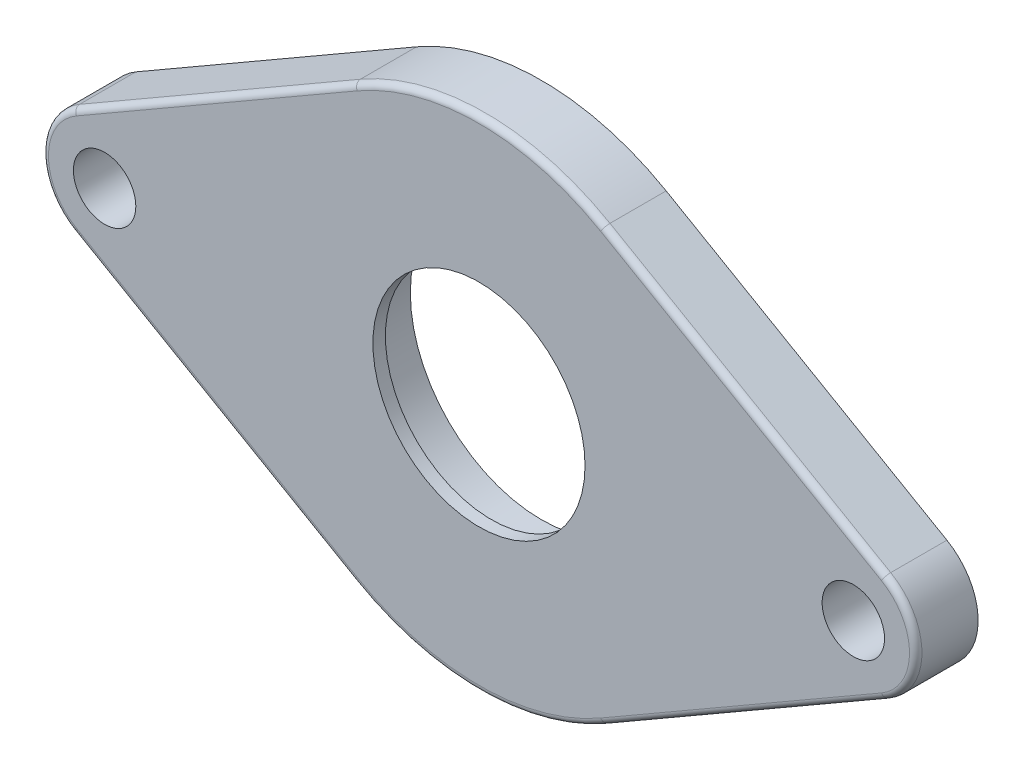
ISO-10303-21;
HEADER;
FILE_DESCRIPTION(('STEP AP214'),'2;1');
FILE_NAME('part.step','',(''),(''),'','','');
FILE_SCHEMA(('AUTOMOTIVE_DESIGN { 1 0 10303 214 1 1 1 1 }'));
ENDSEC;
DATA;
#1=APPLICATION_CONTEXT('core data for automotive mechanical design processes');
#2=APPLICATION_PROTOCOL_DEFINITION('international standard','automotive_design',2000,#1);
#3=PRODUCT_CONTEXT('',#1,'mechanical');
#4=PRODUCT('Part','Part','',(#3));
#5=PRODUCT_RELATED_PRODUCT_CATEGORY('part','',(#4));
#6=PRODUCT_DEFINITION_FORMATION('','',#4);
#7=PRODUCT_DEFINITION_CONTEXT('part definition',#1,'design');
#8=PRODUCT_DEFINITION('design','',#6,#7);
#9=PRODUCT_DEFINITION_SHAPE('','',#8);
#10=(LENGTH_UNIT() NAMED_UNIT(*) SI_UNIT(.MILLI.,.METRE.));
#11=(NAMED_UNIT(*) PLANE_ANGLE_UNIT() SI_UNIT($,.RADIAN.));
#12=(NAMED_UNIT(*) SI_UNIT($,.STERADIAN.) SOLID_ANGLE_UNIT());
#13=UNCERTAINTY_MEASURE_WITH_UNIT(LENGTH_MEASURE(1.E-05),#10,'distance_accuracy_value','');
#14=(GEOMETRIC_REPRESENTATION_CONTEXT(3) GLOBAL_UNCERTAINTY_ASSIGNED_CONTEXT((#13)) GLOBAL_UNIT_ASSIGNED_CONTEXT((#10,
#11,#12)) REPRESENTATION_CONTEXT('',''));
#15=CARTESIAN_POINT('',(0.,0.,0.));
#16=DIRECTION('',(0.,0.,1.));
#17=DIRECTION('',(1.,0.,0.));
#18=AXIS2_PLACEMENT_3D('',#15,#16,#17);
#19=CARTESIAN_POINT('',(0.,65.,0.));
#20=DIRECTION('',(0.,0.,1.));
#21=DIRECTION('',(1.,0.,0.));
#22=AXIS2_PLACEMENT_3D('',#19,#20,#21);
#23=PLANE('',#22);
#24=CARTESIAN_POINT('',(60.,65.,0.));
#25=DIRECTION('',(0.,0.,1.));
#26=DIRECTION('',(1.,0.,0.));
#27=AXIS2_PLACEMENT_3D('',#24,#25,#26);
#28=CIRCLE('',#27,5.00000000000002);
#29=CARTESIAN_POINT('',(65.,65.,0.));
#30=VERTEX_POINT('',#29);
#31=EDGE_CURVE('E625',#30,#30,#28,.T.);
#32=ORIENTED_EDGE('',*,*,#31,.T.);
#33=EDGE_LOOP('',(#32));
#34=FACE_BOUND('',#33,.T.);
#35=CARTESIAN_POINT('',(-60.,65.,0.));
#36=DIRECTION('',(0.,0.,1.));
#37=DIRECTION('',(1.,0.,0.));
#38=AXIS2_PLACEMENT_3D('',#35,#36,#37);
#39=CIRCLE('',#38,5.00000000000001);
#40=CARTESIAN_POINT('',(-54.9999999999999,65.,0.));
#41=VERTEX_POINT('',#40);
#42=EDGE_CURVE('E482',#41,#41,#39,.T.);
#43=ORIENTED_EDGE('',*,*,#42,.T.);
#44=EDGE_LOOP('',(#43));
#45=FACE_BOUND('',#44,.T.);
#46=CARTESIAN_POINT('',(0.,65.,0.));
#47=DIRECTION('',(0.,0.,1.));
#48=DIRECTION('',(1.,0.,0.));
#49=AXIS2_PLACEMENT_3D('',#46,#47,#48);
#50=CIRCLE('',#49,40.);
#51=CARTESIAN_POINT('',(20.,99.6410161513775,0.));
#52=VERTEX_POINT('',#51);
#53=CARTESIAN_POINT('',(-20.,99.6410161513776,0.));
#54=VERTEX_POINT('',#53);
#55=EDGE_CURVE('E471',#52,#54,#50,.T.);
#56=ORIENTED_EDGE('',*,*,#55,.F.);
#57=DIRECTION('',(-0.866025403784439,0.499999999999999,0.));
#58=VECTOR('',#57,1.);
#59=CARTESIAN_POINT('',(65.,73.6602540378444,0.));
#60=LINE('',#59,#58);
#61=CARTESIAN_POINT('',(65.,73.6602540378444,0.));
#62=VERTEX_POINT('',#61);
#63=EDGE_CURVE('E499',#62,#52,#60,.T.);
#64=ORIENTED_EDGE('',*,*,#63,.F.);
#65=CARTESIAN_POINT('',(60.,65.,0.));
#66=DIRECTION('',(0.,0.,1.));
#67=DIRECTION('',(1.,0.,0.));
#68=AXIS2_PLACEMENT_3D('',#65,#66,#67);
#69=CIRCLE('',#68,10.);
#70=CARTESIAN_POINT('',(65.,56.3397459621556,0.));
#71=VERTEX_POINT('',#70);
#72=EDGE_CURVE('E496',#71,#62,#69,.T.);
#73=ORIENTED_EDGE('',*,*,#72,.F.);
#74=DIRECTION('',(0.866025403784439,0.5,0.));
#75=VECTOR('',#74,1.);
#76=CARTESIAN_POINT('',(20.,30.3589838486225,0.));
#77=LINE('',#76,#75);
#78=CARTESIAN_POINT('',(20.,30.3589838486225,0.));
#79=VERTEX_POINT('',#78);
#80=EDGE_CURVE('E493',#79,#71,#77,.T.);
#81=ORIENTED_EDGE('',*,*,#80,.F.);
#82=CARTESIAN_POINT('',(0.,65.,0.));
#83=DIRECTION('',(0.,0.,1.));
#84=DIRECTION('',(1.,0.,0.));
#85=AXIS2_PLACEMENT_3D('',#82,#83,#84);
#86=CIRCLE('',#85,40.);
#87=CARTESIAN_POINT('',(-20.,30.3589838486225,0.));
#88=VERTEX_POINT('',#87);
#89=EDGE_CURVE('E490',#88,#79,#86,.T.);
#90=ORIENTED_EDGE('',*,*,#89,.F.);
#91=DIRECTION('',(0.866025403784439,-0.5,0.));
#92=VECTOR('',#91,1.);
#93=CARTESIAN_POINT('',(-65.,56.3397459621556,0.));
#94=LINE('',#93,#92);
#95=CARTESIAN_POINT('',(-65.,56.3397459621556,0.));
#96=VERTEX_POINT('',#95);
#97=EDGE_CURVE('E487',#96,#88,#94,.T.);
#98=ORIENTED_EDGE('',*,*,#97,.F.);
#99=CARTESIAN_POINT('',(-60.,65.,0.));
#100=DIRECTION('',(0.,0.,1.));
#101=DIRECTION('',(1.,0.,0.));
#102=AXIS2_PLACEMENT_3D('',#99,#100,#101);
#103=CIRCLE('',#102,10.);
#104=CARTESIAN_POINT('',(-65.,73.6602540378444,0.));
#105=VERTEX_POINT('',#104);
#106=EDGE_CURVE('E474',#105,#96,#103,.T.);
#107=ORIENTED_EDGE('',*,*,#106,.F.);
#108=DIRECTION('',(-0.866025403784439,-0.499999999999999,0.));
#109=VECTOR('',#108,1.);
#110=CARTESIAN_POINT('',(-20.,99.6410161513776,0.));
#111=LINE('',#110,#109);
#112=EDGE_CURVE('E459',#54,#105,#111,.T.);
#113=ORIENTED_EDGE('',*,*,#112,.F.);
#114=EDGE_LOOP('',(#56,#64,#73,#81,#90,#98,#107,#113));
#115=FACE_BOUND('',#114,.T.);
#116=CARTESIAN_POINT('',(0.,65.,0.));
#117=DIRECTION('',(0.,0.,1.));
#118=DIRECTION('',(1.,0.,0.));
#119=AXIS2_PLACEMENT_3D('',#116,#117,#118);
#120=CIRCLE('',#119,21.);
#121=CARTESIAN_POINT('',(21.,65.,0.));
#122=VERTEX_POINT('',#121);
#123=EDGE_CURVE('E618',#122,#122,#120,.T.);
#124=ORIENTED_EDGE('',*,*,#123,.T.);
#125=EDGE_LOOP('',(#124));
#126=FACE_BOUND('',#125,.T.);
#127=ADVANCED_FACE('F370',(#34,#45,#115,#126),#23,.F.);
#128=CARTESIAN_POINT('',(0.,65.,10.));
#129=DIRECTION('',(0.,0.,1.));
#130=DIRECTION('',(1.,0.,0.));
#131=AXIS2_PLACEMENT_3D('',#128,#129,#130);
#132=PLANE('',#131);
#133=CARTESIAN_POINT('',(60.,65.,10.));
#134=DIRECTION('',(0.,0.,1.));
#135=DIRECTION('',(1.,0.,0.));
#136=AXIS2_PLACEMENT_3D('',#133,#134,#135);
#137=CIRCLE('',#136,9.00000000000003);
#138=CARTESIAN_POINT('',(64.5,57.2057713659401,10.));
#139=VERTEX_POINT('',#138);
#140=CARTESIAN_POINT('',(64.5,72.79422863406,10.));
#141=VERTEX_POINT('',#140);
#142=EDGE_CURVE('E529',#139,#141,#137,.T.);
#143=ORIENTED_EDGE('',*,*,#142,.T.);
#144=DIRECTION('',(-0.866025403784439,0.5,0.));
#145=VECTOR('',#144,1.);
#146=CARTESIAN_POINT('',(19.5,98.7749907475931,10.));
#147=LINE('',#146,#145);
#148=CARTESIAN_POINT('',(19.5,98.7749907475931,10.));
#149=VERTEX_POINT('',#148);
#150=EDGE_CURVE('E531',#141,#149,#147,.T.);
#151=ORIENTED_EDGE('',*,*,#150,.T.);
#152=CARTESIAN_POINT('',(0.,65.,10.));
#153=DIRECTION('',(0.,0.,1.));
#154=DIRECTION('',(1.,0.,0.));
#155=AXIS2_PLACEMENT_3D('',#152,#153,#154);
#156=CIRCLE('',#155,39.);
#157=CARTESIAN_POINT('',(-19.5,98.7749907475931,10.));
#158=VERTEX_POINT('',#157);
#159=EDGE_CURVE('E464',#149,#158,#156,.T.);
#160=ORIENTED_EDGE('',*,*,#159,.T.);
#161=DIRECTION('',(-0.866025403784439,-0.5,0.));
#162=VECTOR('',#161,1.);
#163=CARTESIAN_POINT('',(-64.5,72.79422863406,10.));
#164=LINE('',#163,#162);
#165=CARTESIAN_POINT('',(-64.5,72.79422863406,10.));
#166=VERTEX_POINT('',#165);
#167=EDGE_CURVE('E519',#158,#166,#164,.T.);
#168=ORIENTED_EDGE('',*,*,#167,.T.);
#169=CARTESIAN_POINT('',(-60.,65.,10.));
#170=DIRECTION('',(0.,0.,1.));
#171=DIRECTION('',(1.,0.,0.));
#172=AXIS2_PLACEMENT_3D('',#169,#170,#171);
#173=CIRCLE('',#172,9.00000000000003);
#174=CARTESIAN_POINT('',(-64.5,57.2057713659401,10.));
#175=VERTEX_POINT('',#174);
#176=EDGE_CURVE('E521',#166,#175,#173,.T.);
#177=ORIENTED_EDGE('',*,*,#176,.T.);
#178=DIRECTION('',(0.866025403784439,-0.5,0.));
#179=VECTOR('',#178,1.);
#180=CARTESIAN_POINT('',(-19.5,31.2250092524069,10.));
#181=LINE('',#180,#179);
#182=CARTESIAN_POINT('',(-19.5,31.2250092524069,10.));
#183=VERTEX_POINT('',#182);
#184=EDGE_CURVE('E523',#175,#183,#181,.T.);
#185=ORIENTED_EDGE('',*,*,#184,.T.);
#186=CARTESIAN_POINT('',(0.,65.,10.));
#187=DIRECTION('',(0.,0.,1.));
#188=DIRECTION('',(1.,0.,0.));
#189=AXIS2_PLACEMENT_3D('',#186,#187,#188);
#190=CIRCLE('',#189,39.);
#191=CARTESIAN_POINT('',(19.5,31.2250092524069,10.));
#192=VERTEX_POINT('',#191);
#193=EDGE_CURVE('E525',#183,#192,#190,.T.);
#194=ORIENTED_EDGE('',*,*,#193,.T.);
#195=DIRECTION('',(0.866025403784439,0.5,0.));
#196=VECTOR('',#195,1.);
#197=CARTESIAN_POINT('',(64.5,57.2057713659401,10.));
#198=LINE('',#197,#196);
#199=EDGE_CURVE('E527',#192,#139,#198,.T.);
#200=ORIENTED_EDGE('',*,*,#199,.T.);
#201=EDGE_LOOP('',(#143,#151,#160,#168,#177,#185,#194,#200));
#202=FACE_BOUND('',#201,.T.);
#203=CARTESIAN_POINT('',(0.,65.,10.));
#204=DIRECTION('',(0.,0.,1.));
#205=DIRECTION('',(1.,0.,0.));
#206=AXIS2_PLACEMENT_3D('',#203,#204,#205);
#207=CIRCLE('',#206,17.);
#208=CARTESIAN_POINT('',(17.,65.,10.));
#209=VERTEX_POINT('',#208);
#210=EDGE_CURVE('E628',#209,#209,#207,.T.);
#211=ORIENTED_EDGE('',*,*,#210,.F.);
#212=EDGE_LOOP('',(#211));
#213=FACE_BOUND('',#212,.T.);
#214=CARTESIAN_POINT('',(-60.,65.,10.));
#215=DIRECTION('',(0.,0.,1.));
#216=DIRECTION('',(1.,0.,0.));
#217=AXIS2_PLACEMENT_3D('',#214,#215,#216);
#218=CIRCLE('',#217,5.00000000000001);
#219=CARTESIAN_POINT('',(-54.9999999999999,65.,10.));
#220=VERTEX_POINT('',#219);
#221=EDGE_CURVE('E479',#220,#220,#218,.T.);
#222=ORIENTED_EDGE('',*,*,#221,.F.);
#223=EDGE_LOOP('',(#222));
#224=FACE_BOUND('',#223,.T.);
#225=CARTESIAN_POINT('',(60.,65.,10.));
#226=DIRECTION('',(0.,0.,1.));
#227=DIRECTION('',(1.,0.,0.));
#228=AXIS2_PLACEMENT_3D('',#225,#226,#227);
#229=CIRCLE('',#228,5.00000000000002);
#230=CARTESIAN_POINT('',(65.,65.,10.));
#231=VERTEX_POINT('',#230);
#232=EDGE_CURVE('E516',#231,#231,#229,.T.);
#233=ORIENTED_EDGE('',*,*,#232,.F.);
#234=EDGE_LOOP('',(#233));
#235=FACE_BOUND('',#234,.T.);
#236=ADVANCED_FACE('F650',(#202,#213,#224,#235),#132,.T.);
#237=CARTESIAN_POINT('',(0.,65.,10.));
#238=DIRECTION('',(0.,0.,-1.));
#239=DIRECTION('',(-1.,0.,0.));
#240=AXIS2_PLACEMENT_3D('',#237,#238,#239);
#241=CYLINDRICAL_SURFACE('',#240,40.);
#242=DIRECTION('',(0.,0.,-1.));
#243=VECTOR('',#242,1.);
#244=CARTESIAN_POINT('',(-20.,99.6410161513776,10.));
#245=LINE('',#244,#243);
#246=CARTESIAN_POINT('',(-20.,99.6410161513776,9.));
#247=VERTEX_POINT('',#246);
#248=EDGE_CURVE('E456',#247,#54,#245,.T.);
#249=ORIENTED_EDGE('',*,*,#248,.F.);
#250=CARTESIAN_POINT('',(0.,65.,9.));
#251=DIRECTION('',(0.,0.,1.));
#252=DIRECTION('',(1.,0.,0.));
#253=AXIS2_PLACEMENT_3D('',#250,#251,#252);
#254=CIRCLE('',#253,40.);
#255=CARTESIAN_POINT('',(20.,99.6410161513775,9.));
#256=VERTEX_POINT('',#255);
#257=EDGE_CURVE('E11',#247,#256,#254,.F.);
#258=ORIENTED_EDGE('',*,*,#257,.T.);
#259=DIRECTION('',(0.,0.,-1.));
#260=VECTOR('',#259,1.);
#261=CARTESIAN_POINT('',(20.,99.6410161513775,10.));
#262=LINE('',#261,#260);
#263=EDGE_CURVE('E477',#256,#52,#262,.T.);
#264=ORIENTED_EDGE('',*,*,#263,.T.);
#265=ORIENTED_EDGE('',*,*,#55,.T.);
#266=EDGE_LOOP('',(#249,#258,#264,#265));
#267=FACE_BOUND('',#266,.T.);
#268=ADVANCED_FACE('F372',(#267),#241,.T.);
#269=CARTESIAN_POINT('',(-20.,99.6410161513776,10.));
#270=DIRECTION('',(0.5,-0.866025403784439,0.));
#271=DIRECTION('',(0.866025403784439,0.5,0.));
#272=AXIS2_PLACEMENT_3D('',#269,#270,#271);
#273=PLANE('',#272);
#274=DIRECTION('',(0.,0.,-1.));
#275=VECTOR('',#274,1.);
#276=CARTESIAN_POINT('',(-65.,73.6602540378444,10.));
#277=LINE('',#276,#275);
#278=CARTESIAN_POINT('',(-65.,73.6602540378444,9.));
#279=VERTEX_POINT('',#278);
#280=EDGE_CURVE('E465',#279,#105,#277,.T.);
#281=ORIENTED_EDGE('',*,*,#280,.F.);
#282=DIRECTION('',(-0.866025403784439,-0.5,0.));
#283=VECTOR('',#282,1.);
#284=CARTESIAN_POINT('',(-20.,99.6410161513776,9.));
#285=LINE('',#284,#283);
#286=EDGE_CURVE('E378',#279,#247,#285,.F.);
#287=ORIENTED_EDGE('',*,*,#286,.T.);
#288=ORIENTED_EDGE('',*,*,#248,.T.);
#289=ORIENTED_EDGE('',*,*,#112,.T.);
#290=EDGE_LOOP('',(#281,#287,#288,#289));
#291=FACE_BOUND('',#290,.T.);
#292=ADVANCED_FACE('F458',(#291),#273,.F.);
#293=CARTESIAN_POINT('',(-60.,65.,10.));
#294=DIRECTION('',(0.,0.,-1.));
#295=DIRECTION('',(-1.,0.,0.));
#296=AXIS2_PLACEMENT_3D('',#293,#294,#295);
#297=CYLINDRICAL_SURFACE('',#296,10.);
#298=DIRECTION('',(0.,0.,-1.));
#299=VECTOR('',#298,1.);
#300=CARTESIAN_POINT('',(-65.,56.3397459621556,10.));
#301=LINE('',#300,#299);
#302=CARTESIAN_POINT('',(-65.,56.3397459621556,9.));
#303=VERTEX_POINT('',#302);
#304=EDGE_CURVE('E510',#303,#96,#301,.T.);
#305=ORIENTED_EDGE('',*,*,#304,.F.);
#306=CARTESIAN_POINT('',(-60.,65.,9.));
#307=DIRECTION('',(0.,0.,1.));
#308=DIRECTION('',(1.,0.,0.));
#309=AXIS2_PLACEMENT_3D('',#306,#307,#308);
#310=CIRCLE('',#309,10.);
#311=EDGE_CURVE('E392',#303,#279,#310,.F.);
#312=ORIENTED_EDGE('',*,*,#311,.T.);
#313=ORIENTED_EDGE('',*,*,#280,.T.);
#314=ORIENTED_EDGE('',*,*,#106,.T.);
#315=EDGE_LOOP('',(#305,#312,#313,#314));
#316=FACE_BOUND('',#315,.T.);
#317=ADVANCED_FACE('F553',(#316),#297,.T.);
#318=CARTESIAN_POINT('',(-65.,56.3397459621556,10.));
#319=DIRECTION('',(0.5,0.866025403784439,0.));
#320=DIRECTION('',(-0.866025403784439,0.5,0.));
#321=AXIS2_PLACEMENT_3D('',#318,#319,#320);
#322=PLANE('',#321);
#323=DIRECTION('',(0.,0.,-1.));
#324=VECTOR('',#323,1.);
#325=CARTESIAN_POINT('',(-20.,30.3589838486225,10.));
#326=LINE('',#325,#324);
#327=CARTESIAN_POINT('',(-20.,30.3589838486225,9.));
#328=VERTEX_POINT('',#327);
#329=EDGE_CURVE('E508',#328,#88,#326,.T.);
#330=ORIENTED_EDGE('',*,*,#329,.F.);
#331=DIRECTION('',(0.866025403784439,-0.5,0.));
#332=VECTOR('',#331,1.);
#333=CARTESIAN_POINT('',(-65.,56.3397459621556,9.));
#334=LINE('',#333,#332);
#335=EDGE_CURVE('E543',#328,#303,#334,.F.);
#336=ORIENTED_EDGE('',*,*,#335,.T.);
#337=ORIENTED_EDGE('',*,*,#304,.T.);
#338=ORIENTED_EDGE('',*,*,#97,.T.);
#339=EDGE_LOOP('',(#330,#336,#337,#338));
#340=FACE_BOUND('',#339,.T.);
#341=ADVANCED_FACE('F548',(#340),#322,.F.);
#342=CARTESIAN_POINT('',(0.,65.,10.));
#343=DIRECTION('',(0.,0.,-1.));
#344=DIRECTION('',(-1.,0.,0.));
#345=AXIS2_PLACEMENT_3D('',#342,#343,#344);
#346=CYLINDRICAL_SURFACE('',#345,40.);
#347=DIRECTION('',(0.,0.,-1.));
#348=VECTOR('',#347,1.);
#349=CARTESIAN_POINT('',(20.,30.3589838486225,10.));
#350=LINE('',#349,#348);
#351=CARTESIAN_POINT('',(20.,30.3589838486225,9.));
#352=VERTEX_POINT('',#351);
#353=EDGE_CURVE('E506',#352,#79,#350,.T.);
#354=ORIENTED_EDGE('',*,*,#353,.F.);
#355=CARTESIAN_POINT('',(0.,65.,9.));
#356=DIRECTION('',(0.,0.,1.));
#357=DIRECTION('',(1.,0.,0.));
#358=AXIS2_PLACEMENT_3D('',#355,#356,#357);
#359=CIRCLE('',#358,40.);
#360=EDGE_CURVE('E541',#352,#328,#359,.F.);
#361=ORIENTED_EDGE('',*,*,#360,.T.);
#362=ORIENTED_EDGE('',*,*,#329,.T.);
#363=ORIENTED_EDGE('',*,*,#89,.T.);
#364=EDGE_LOOP('',(#354,#361,#362,#363));
#365=FACE_BOUND('',#364,.T.);
#366=ADVANCED_FACE('F662',(#365),#346,.T.);
#367=CARTESIAN_POINT('',(20.,30.3589838486225,10.));
#368=DIRECTION('',(-0.5,0.866025403784439,0.));
#369=DIRECTION('',(-0.866025403784439,-0.5,0.));
#370=AXIS2_PLACEMENT_3D('',#367,#368,#369);
#371=PLANE('',#370);
#372=DIRECTION('',(0.,0.,-1.));
#373=VECTOR('',#372,1.);
#374=CARTESIAN_POINT('',(65.,56.3397459621556,10.));
#375=LINE('',#374,#373);
#376=CARTESIAN_POINT('',(65.,56.3397459621556,9.));
#377=VERTEX_POINT('',#376);
#378=EDGE_CURVE('E504',#377,#71,#375,.T.);
#379=ORIENTED_EDGE('',*,*,#378,.F.);
#380=DIRECTION('',(0.866025403784439,0.5,0.));
#381=VECTOR('',#380,1.);
#382=CARTESIAN_POINT('',(20.,30.3589838486225,9.));
#383=LINE('',#382,#381);
#384=EDGE_CURVE('E539',#377,#352,#383,.F.);
#385=ORIENTED_EDGE('',*,*,#384,.T.);
#386=ORIENTED_EDGE('',*,*,#353,.T.);
#387=ORIENTED_EDGE('',*,*,#80,.T.);
#388=EDGE_LOOP('',(#379,#385,#386,#387));
#389=FACE_BOUND('',#388,.T.);
#390=ADVANCED_FACE('F602',(#389),#371,.F.);
#391=CARTESIAN_POINT('',(60.,65.,10.));
#392=DIRECTION('',(0.,0.,-1.));
#393=DIRECTION('',(-1.,0.,0.));
#394=AXIS2_PLACEMENT_3D('',#391,#392,#393);
#395=CYLINDRICAL_SURFACE('',#394,10.);
#396=DIRECTION('',(0.,0.,-1.));
#397=VECTOR('',#396,1.);
#398=CARTESIAN_POINT('',(65.,73.6602540378444,10.));
#399=LINE('',#398,#397);
#400=CARTESIAN_POINT('',(65.,73.6602540378444,9.));
#401=VERTEX_POINT('',#400);
#402=EDGE_CURVE('E502',#401,#62,#399,.T.);
#403=ORIENTED_EDGE('',*,*,#402,.F.);
#404=CARTESIAN_POINT('',(60.,65.,9.));
#405=DIRECTION('',(0.,0.,1.));
#406=DIRECTION('',(1.,0.,0.));
#407=AXIS2_PLACEMENT_3D('',#404,#405,#406);
#408=CIRCLE('',#407,10.);
#409=EDGE_CURVE('E537',#401,#377,#408,.F.);
#410=ORIENTED_EDGE('',*,*,#409,.T.);
#411=ORIENTED_EDGE('',*,*,#378,.T.);
#412=ORIENTED_EDGE('',*,*,#72,.T.);
#413=EDGE_LOOP('',(#403,#410,#411,#412));
#414=FACE_BOUND('',#413,.T.);
#415=ADVANCED_FACE('F599',(#414),#395,.T.);
#416=CARTESIAN_POINT('',(65.,73.6602540378444,10.));
#417=DIRECTION('',(-0.5,-0.866025403784439,0.));
#418=DIRECTION('',(0.866025403784439,-0.5,0.));
#419=AXIS2_PLACEMENT_3D('',#416,#417,#418);
#420=PLANE('',#419);
#421=ORIENTED_EDGE('',*,*,#263,.F.);
#422=DIRECTION('',(-0.866025403784439,0.5,0.));
#423=VECTOR('',#422,1.);
#424=CARTESIAN_POINT('',(65.,73.6602540378444,9.));
#425=LINE('',#424,#423);
#426=EDGE_CURVE('E534',#256,#401,#425,.F.);
#427=ORIENTED_EDGE('',*,*,#426,.T.);
#428=ORIENTED_EDGE('',*,*,#402,.T.);
#429=ORIENTED_EDGE('',*,*,#63,.T.);
#430=EDGE_LOOP('',(#421,#427,#428,#429));
#431=FACE_BOUND('',#430,.T.);
#432=ADVANCED_FACE('F584',(#431),#420,.F.);
#433=CARTESIAN_POINT('',(-60.,65.,10.));
#434=DIRECTION('',(0.,0.,-1.));
#435=DIRECTION('',(-1.,0.,0.));
#436=AXIS2_PLACEMENT_3D('',#433,#434,#435);
#437=CYLINDRICAL_SURFACE('',#436,5.00000000000001);
#438=ORIENTED_EDGE('',*,*,#221,.T.);
#439=EDGE_LOOP('',(#438));
#440=FACE_BOUND('',#439,.T.);
#441=ORIENTED_EDGE('',*,*,#42,.F.);
#442=EDGE_LOOP('',(#441));
#443=FACE_BOUND('',#442,.T.);
#444=ADVANCED_FACE('F634',(#440,#443),#437,.F.);
#445=CARTESIAN_POINT('',(0.,65.,10.));
#446=DIRECTION('',(0.,0.,-1.));
#447=DIRECTION('',(-1.,0.,0.));
#448=AXIS2_PLACEMENT_3D('',#445,#446,#447);
#449=CYLINDRICAL_SURFACE('',#448,17.);
#450=CARTESIAN_POINT('',(0.,65.,8.));
#451=DIRECTION('',(0.,0.,1.));
#452=DIRECTION('',(1.,0.,0.));
#453=AXIS2_PLACEMENT_3D('',#450,#451,#452);
#454=CIRCLE('',#453,17.);
#455=CARTESIAN_POINT('',(17.,65.,8.));
#456=VERTEX_POINT('',#455);
#457=EDGE_CURVE('E513',#456,#456,#454,.T.);
#458=ORIENTED_EDGE('',*,*,#457,.F.);
#459=EDGE_LOOP('',(#458));
#460=FACE_BOUND('',#459,.T.);
#461=ORIENTED_EDGE('',*,*,#210,.T.);
#462=EDGE_LOOP('',(#461));
#463=FACE_BOUND('',#462,.T.);
#464=ADVANCED_FACE('F636',(#460,#463),#449,.F.);
#465=CARTESIAN_POINT('',(60.,65.,10.));
#466=DIRECTION('',(0.,0.,-1.));
#467=DIRECTION('',(-1.,0.,0.));
#468=AXIS2_PLACEMENT_3D('',#465,#466,#467);
#469=CYLINDRICAL_SURFACE('',#468,5.00000000000002);
#470=ORIENTED_EDGE('',*,*,#232,.T.);
#471=EDGE_LOOP('',(#470));
#472=FACE_BOUND('',#471,.T.);
#473=ORIENTED_EDGE('',*,*,#31,.F.);
#474=EDGE_LOOP('',(#473));
#475=FACE_BOUND('',#474,.T.);
#476=ADVANCED_FACE('F643',(#472,#475),#469,.F.);
#477=CARTESIAN_POINT('',(0.,65.,8.));
#478=DIRECTION('',(0.,0.,-1.));
#479=DIRECTION('',(-1.,0.,0.));
#480=AXIS2_PLACEMENT_3D('',#477,#478,#479);
#481=CYLINDRICAL_SURFACE('',#480,21.);
#482=CARTESIAN_POINT('',(0.,65.,8.));
#483=DIRECTION('',(0.,0.,1.));
#484=DIRECTION('',(1.,0.,0.));
#485=AXIS2_PLACEMENT_3D('',#482,#483,#484);
#486=CIRCLE('',#485,21.);
#487=CARTESIAN_POINT('',(21.,65.,8.));
#488=VERTEX_POINT('',#487);
#489=EDGE_CURVE('E517',#488,#488,#486,.T.);
#490=ORIENTED_EDGE('',*,*,#489,.T.);
#491=EDGE_LOOP('',(#490));
#492=FACE_BOUND('',#491,.T.);
#493=ORIENTED_EDGE('',*,*,#123,.F.);
#494=EDGE_LOOP('',(#493));
#495=FACE_BOUND('',#494,.T.);
#496=ADVANCED_FACE('F687',(#492,#495),#481,.F.);
#497=CARTESIAN_POINT('',(0.,65.,8.));
#498=DIRECTION('',(0.,0.,1.));
#499=DIRECTION('',(1.,0.,0.));
#500=AXIS2_PLACEMENT_3D('',#497,#498,#499);
#501=PLANE('',#500);
#502=ORIENTED_EDGE('',*,*,#457,.T.);
#503=EDGE_LOOP('',(#502));
#504=FACE_BOUND('',#503,.T.);
#505=ORIENTED_EDGE('',*,*,#489,.F.);
#506=EDGE_LOOP('',(#505));
#507=FACE_BOUND('',#506,.T.);
#508=ADVANCED_FACE('F683',(#504,#507),#501,.F.);
#509=CARTESIAN_POINT('',(-19.5,31.2250092524069,9.));
#510=DIRECTION('',(-0.866025403784439,0.5,0.));
#511=DIRECTION('',(-0.5,-0.866025403784439,0.));
#512=AXIS2_PLACEMENT_3D('',#509,#510,#511);
#513=CYLINDRICAL_SURFACE('',#512,1.);
#514=CARTESIAN_POINT('',(-64.5,57.2057713659401,9.));
#515=DIRECTION('',(-0.866025403784438,0.500000000000001,0.));
#516=DIRECTION('',(-0.500000000000001,-0.866025403784438,0.));
#517=AXIS2_PLACEMENT_3D('',#514,#515,#516);
#518=CIRCLE('',#517,1.);
#519=EDGE_CURVE('E556',#303,#175,#518,.T.);
#520=ORIENTED_EDGE('',*,*,#519,.F.);
#521=ORIENTED_EDGE('',*,*,#335,.F.);
#522=CARTESIAN_POINT('',(-19.5,31.2250092524069,9.));
#523=DIRECTION('',(0.866025403784439,-0.5,0.));
#524=DIRECTION('',(0.5,0.866025403784439,0.));
#525=AXIS2_PLACEMENT_3D('',#522,#523,#524);
#526=CIRCLE('',#525,1.);
#527=EDGE_CURVE('E560',#183,#328,#526,.T.);
#528=ORIENTED_EDGE('',*,*,#527,.F.);
#529=ORIENTED_EDGE('',*,*,#184,.F.);
#530=EDGE_LOOP('',(#520,#521,#528,#529));
#531=FACE_BOUND('',#530,.T.);
#532=ADVANCED_FACE('F557',(#531),#513,.T.);
#533=CARTESIAN_POINT('',(0.,65.,9.));
#534=DIRECTION('',(0.,0.,1.));
#535=DIRECTION('',(1.,0.,0.));
#536=AXIS2_PLACEMENT_3D('',#533,#534,#535);
#537=TOROIDAL_SURFACE('',#536,39.,1.);
#538=ORIENTED_EDGE('',*,*,#527,.T.);
#539=ORIENTED_EDGE('',*,*,#360,.F.);
#540=CARTESIAN_POINT('',(19.5,31.2250092524069,9.));
#541=DIRECTION('',(0.866025403784439,0.5,0.));
#542=DIRECTION('',(-0.5,0.866025403784439,0.));
#543=AXIS2_PLACEMENT_3D('',#540,#541,#542);
#544=CIRCLE('',#543,1.);
#545=EDGE_CURVE('E561',#192,#352,#544,.T.);
#546=ORIENTED_EDGE('',*,*,#545,.F.);
#547=ORIENTED_EDGE('',*,*,#193,.F.);
#548=EDGE_LOOP('',(#538,#539,#546,#547));
#549=FACE_BOUND('',#548,.T.);
#550=ADVANCED_FACE('F717',(#549),#537,.T.);
#551=CARTESIAN_POINT('',(-60.,65.,9.));
#552=DIRECTION('',(0.,0.,1.));
#553=DIRECTION('',(1.,0.,0.));
#554=AXIS2_PLACEMENT_3D('',#551,#552,#553);
#555=TOROIDAL_SURFACE('',#554,9.00000000000003,1.);
#556=ORIENTED_EDGE('',*,*,#519,.T.);
#557=ORIENTED_EDGE('',*,*,#176,.F.);
#558=CARTESIAN_POINT('',(-64.5,72.79422863406,9.));
#559=DIRECTION('',(0.86602540378444,0.499999999999999,0.));
#560=DIRECTION('',(-0.499999999999999,0.86602540378444,0.));
#561=AXIS2_PLACEMENT_3D('',#558,#559,#560);
#562=CIRCLE('',#561,1.);
#563=EDGE_CURVE('E566',#279,#166,#562,.T.);
#564=ORIENTED_EDGE('',*,*,#563,.F.);
#565=ORIENTED_EDGE('',*,*,#311,.F.);
#566=EDGE_LOOP('',(#556,#557,#564,#565));
#567=FACE_BOUND('',#566,.T.);
#568=ADVANCED_FACE('F564',(#567),#555,.T.);
#569=CARTESIAN_POINT('',(19.5,31.2250092524069,9.));
#570=DIRECTION('',(-0.866025403784439,-0.5,0.));
#571=DIRECTION('',(0.5,-0.866025403784439,0.));
#572=AXIS2_PLACEMENT_3D('',#569,#570,#571);
#573=CYLINDRICAL_SURFACE('',#572,1.);
#574=ORIENTED_EDGE('',*,*,#545,.T.);
#575=ORIENTED_EDGE('',*,*,#384,.F.);
#576=CARTESIAN_POINT('',(64.5,57.2057713659401,9.));
#577=DIRECTION('',(0.866025403784438,0.500000000000001,0.));
#578=DIRECTION('',(-0.500000000000001,0.866025403784438,0.));
#579=AXIS2_PLACEMENT_3D('',#576,#577,#578);
#580=CIRCLE('',#579,1.);
#581=EDGE_CURVE('E569',#139,#377,#580,.T.);
#582=ORIENTED_EDGE('',*,*,#581,.F.);
#583=ORIENTED_EDGE('',*,*,#199,.F.);
#584=EDGE_LOOP('',(#574,#575,#582,#583));
#585=FACE_BOUND('',#584,.T.);
#586=ADVANCED_FACE('F608',(#585),#573,.T.);
#587=CARTESIAN_POINT('',(-19.5,98.7749907475931,9.));
#588=DIRECTION('',(0.866025403784439,0.5,0.));
#589=DIRECTION('',(-0.5,0.866025403784439,0.));
#590=AXIS2_PLACEMENT_3D('',#587,#588,#589);
#591=CYLINDRICAL_SURFACE('',#590,1.);
#592=ORIENTED_EDGE('',*,*,#563,.T.);
#593=ORIENTED_EDGE('',*,*,#167,.F.);
#594=CARTESIAN_POINT('',(-19.5,98.7749907475931,9.));
#595=DIRECTION('',(0.86602540378444,0.499999999999999,0.));
#596=DIRECTION('',(-0.499999999999999,0.86602540378444,0.));
#597=AXIS2_PLACEMENT_3D('',#594,#595,#596);
#598=CIRCLE('',#597,1.);
#599=EDGE_CURVE('E573',#247,#158,#598,.T.);
#600=ORIENTED_EDGE('',*,*,#599,.F.);
#601=ORIENTED_EDGE('',*,*,#286,.F.);
#602=EDGE_LOOP('',(#592,#593,#600,#601));
#603=FACE_BOUND('',#602,.T.);
#604=ADVANCED_FACE('F571',(#603),#591,.T.);
#605=CARTESIAN_POINT('',(60.,65.,9.));
#606=DIRECTION('',(0.,0.,1.));
#607=DIRECTION('',(1.,0.,0.));
#608=AXIS2_PLACEMENT_3D('',#605,#606,#607);
#609=TOROIDAL_SURFACE('',#608,9.00000000000003,1.);
#610=ORIENTED_EDGE('',*,*,#581,.T.);
#611=ORIENTED_EDGE('',*,*,#409,.F.);
#612=CARTESIAN_POINT('',(64.5,72.79422863406,9.));
#613=DIRECTION('',(-0.86602540378444,0.499999999999999,0.));
#614=DIRECTION('',(-0.499999999999999,-0.86602540378444,0.));
#615=AXIS2_PLACEMENT_3D('',#612,#613,#614);
#616=CIRCLE('',#615,1.);
#617=EDGE_CURVE('E577',#141,#401,#616,.T.);
#618=ORIENTED_EDGE('',*,*,#617,.F.);
#619=ORIENTED_EDGE('',*,*,#142,.F.);
#620=EDGE_LOOP('',(#610,#611,#618,#619));
#621=FACE_BOUND('',#620,.T.);
#622=ADVANCED_FACE('F595',(#621),#609,.T.);
#623=CARTESIAN_POINT('',(0.,65.,9.));
#624=DIRECTION('',(0.,0.,1.));
#625=DIRECTION('',(1.,0.,0.));
#626=AXIS2_PLACEMENT_3D('',#623,#624,#625);
#627=TOROIDAL_SURFACE('',#626,39.,1.);
#628=ORIENTED_EDGE('',*,*,#599,.T.);
#629=ORIENTED_EDGE('',*,*,#159,.F.);
#630=CARTESIAN_POINT('',(19.5,98.7749907475931,9.));
#631=DIRECTION('',(0.86602540378444,-0.499999999999999,0.));
#632=DIRECTION('',(0.499999999999999,0.86602540378444,0.));
#633=AXIS2_PLACEMENT_3D('',#630,#631,#632);
#634=CIRCLE('',#633,1.);
#635=EDGE_CURVE('E581',#256,#149,#634,.T.);
#636=ORIENTED_EDGE('',*,*,#635,.F.);
#637=ORIENTED_EDGE('',*,*,#257,.F.);
#638=EDGE_LOOP('',(#628,#629,#636,#637));
#639=FACE_BOUND('',#638,.T.);
#640=ADVANCED_FACE('F580',(#639),#627,.T.);
#641=CARTESIAN_POINT('',(19.5,98.7749907475931,9.));
#642=DIRECTION('',(0.866025403784439,-0.5,0.));
#643=DIRECTION('',(0.5,0.866025403784439,0.));
#644=AXIS2_PLACEMENT_3D('',#641,#642,#643);
#645=CYLINDRICAL_SURFACE('',#644,1.);
#646=ORIENTED_EDGE('',*,*,#617,.T.);
#647=ORIENTED_EDGE('',*,*,#426,.F.);
#648=ORIENTED_EDGE('',*,*,#635,.T.);
#649=ORIENTED_EDGE('',*,*,#150,.F.);
#650=EDGE_LOOP('',(#646,#647,#648,#649));
#651=FACE_BOUND('',#650,.T.);
#652=ADVANCED_FACE('F587',(#651),#645,.T.);
#653=CLOSED_SHELL('',(#127,#236,#268,#292,#317,#341,#366,#390,#415,#432,#444,#464,#476,#496,
#508,#532,#550,#568,#586,#604,#622,#640,#652));
#654=MANIFOLD_SOLID_BREP('B2',#653);
#655=ADVANCED_BREP_SHAPE_REPRESENTATION('',(#18,#654),#14);
#656=SHAPE_DEFINITION_REPRESENTATION(#9,#655);
ENDSEC;
END-ISO-10303-21;
